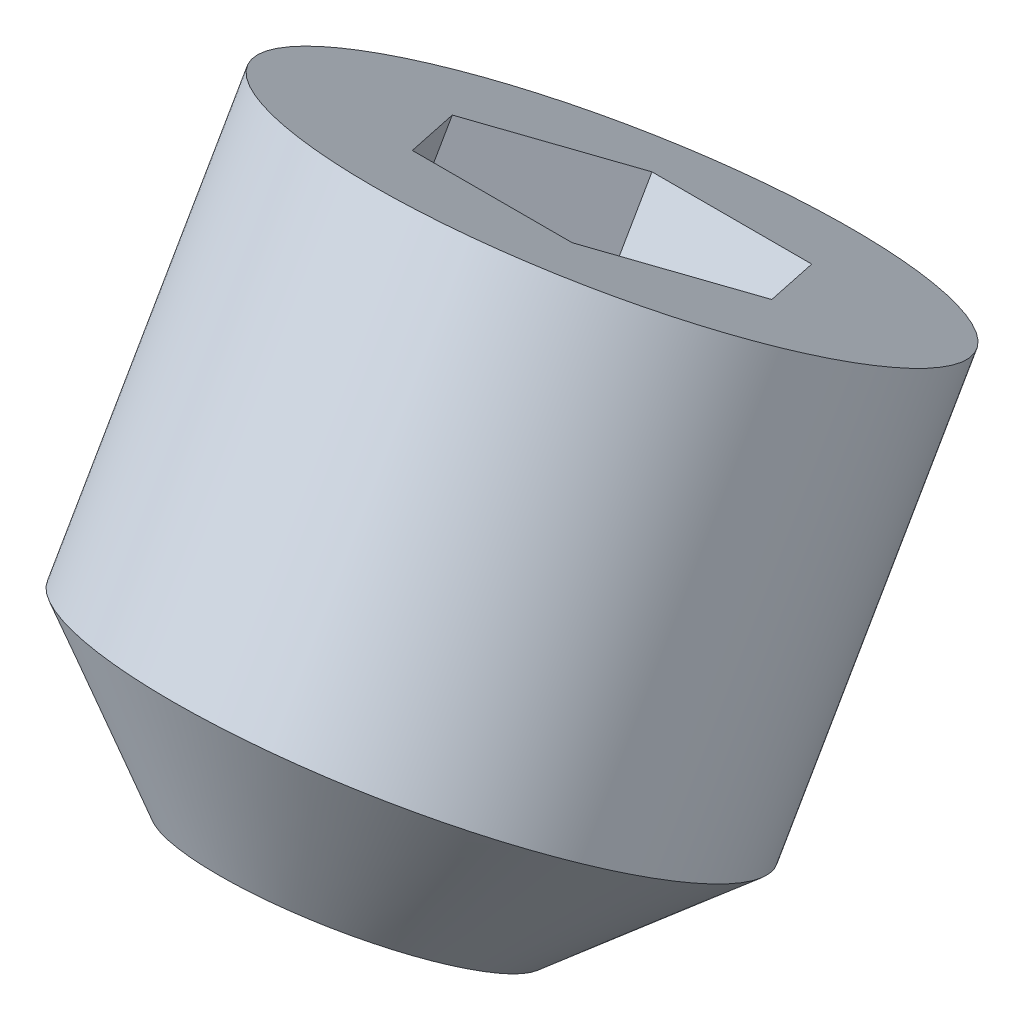
ISO-10303-21;
HEADER;
FILE_DESCRIPTION(('STEP AP214'),'2;1');
FILE_NAME('part.step','',(''),(''),'','','');
FILE_SCHEMA(('AUTOMOTIVE_DESIGN { 1 0 10303 214 1 1 1 1 }'));
ENDSEC;
DATA;
#1=APPLICATION_CONTEXT('core data for automotive mechanical design processes');
#2=APPLICATION_PROTOCOL_DEFINITION('international standard','automotive_design',2000,#1);
#3=PRODUCT_CONTEXT('',#1,'mechanical');
#4=PRODUCT('Part','Part','',(#3));
#5=PRODUCT_RELATED_PRODUCT_CATEGORY('part','',(#4));
#6=PRODUCT_DEFINITION_FORMATION('','',#4);
#7=PRODUCT_DEFINITION_CONTEXT('part definition',#1,'design');
#8=PRODUCT_DEFINITION('design','',#6,#7);
#9=PRODUCT_DEFINITION_SHAPE('','',#8);
#10=(LENGTH_UNIT() NAMED_UNIT(*) SI_UNIT(.MILLI.,.METRE.));
#11=(NAMED_UNIT(*) PLANE_ANGLE_UNIT() SI_UNIT($,.RADIAN.));
#12=(NAMED_UNIT(*) SI_UNIT($,.STERADIAN.) SOLID_ANGLE_UNIT());
#13=UNCERTAINTY_MEASURE_WITH_UNIT(LENGTH_MEASURE(1.E-05),#10,'distance_accuracy_value','');
#14=(GEOMETRIC_REPRESENTATION_CONTEXT(3) GLOBAL_UNCERTAINTY_ASSIGNED_CONTEXT((#13)) GLOBAL_UNIT_ASSIGNED_CONTEXT((#10,
#11,#12)) REPRESENTATION_CONTEXT('',''));
#15=CARTESIAN_POINT('',(0.,0.,0.));
#16=DIRECTION('',(0.,0.,1.));
#17=DIRECTION('',(1.,0.,0.));
#18=AXIS2_PLACEMENT_3D('',#15,#16,#17);
#19=CARTESIAN_POINT('',(22.6,26.7731753579959,-15.4575));
#20=DIRECTION('',(0.,0.866025403784438,-0.5));
#21=DIRECTION('',(0.,0.5,0.866025403784438));
#22=AXIS2_PLACEMENT_3D('',#19,#20,#21);
#23=PLANE('',#22);
#24=DIRECTION('',(0.500000000000001,-0.433012701892219,-0.749999999999999));
#25=VECTOR('',#24,1.);
#26=CARTESIAN_POINT('',(24.0433756729741,28.0231753579959,-13.2924364905389));
#27=LINE('',#26,#25);
#28=CARTESIAN_POINT('',(24.0433756729741,28.0231753579959,-13.2924364905389));
#29=VERTEX_POINT('',#28);
#30=CARTESIAN_POINT('',(25.4867513459481,26.7731753579959,-15.4575));
#31=VERTEX_POINT('',#30);
#32=EDGE_CURVE('E127',#29,#31,#27,.T.);
#33=ORIENTED_EDGE('',*,*,#32,.T.);
#34=DIRECTION('',(-0.5,-0.43301270189222,-0.75));
#35=VECTOR('',#34,1.);
#36=CARTESIAN_POINT('',(25.4867513459481,26.7731753579959,-15.4575));
#37=LINE('',#36,#35);
#38=CARTESIAN_POINT('',(24.0433756729741,25.5231753579959,-17.6225635094611));
#39=VERTEX_POINT('',#38);
#40=EDGE_CURVE('E67',#31,#39,#37,.T.);
#41=ORIENTED_EDGE('',*,*,#40,.T.);
#42=DIRECTION('',(1.,0.,0.));
#43=VECTOR('',#42,1.);
#44=CARTESIAN_POINT('',(23.321687836487,25.5231753579959,-17.6225635094611));
#45=LINE('',#44,#43);
#46=CARTESIAN_POINT('',(21.1566243270259,25.5231753579959,-17.6225635094611));
#47=VERTEX_POINT('',#46);
#48=EDGE_CURVE('E131',#39,#47,#45,.F.);
#49=ORIENTED_EDGE('',*,*,#48,.T.);
#50=DIRECTION('',(-0.5,0.43301270189222,0.75));
#51=VECTOR('',#50,1.);
#52=CARTESIAN_POINT('',(21.1566243270259,25.5231753579959,-17.6225635094611));
#53=LINE('',#52,#51);
#54=CARTESIAN_POINT('',(19.7132486540519,26.7731753579959,-15.4575));
#55=VERTEX_POINT('',#54);
#56=EDGE_CURVE('E139',#47,#55,#53,.T.);
#57=ORIENTED_EDGE('',*,*,#56,.T.);
#58=DIRECTION('',(0.500000000000001,0.433012701892219,0.749999999999999));
#59=VECTOR('',#58,1.);
#60=CARTESIAN_POINT('',(19.7132486540519,26.7731753579959,-15.4575));
#61=LINE('',#60,#59);
#62=CARTESIAN_POINT('',(21.1566243270259,28.0231753579959,-13.2924364905389));
#63=VERTEX_POINT('',#62);
#64=EDGE_CURVE('E149',#55,#63,#61,.T.);
#65=ORIENTED_EDGE('',*,*,#64,.T.);
#66=DIRECTION('',(1.,0.,0.));
#67=VECTOR('',#66,1.);
#68=CARTESIAN_POINT('',(22.6,28.0231753579959,-13.2924364905389));
#69=LINE('',#68,#67);
#70=EDGE_CURVE('E153',#63,#29,#69,.T.);
#71=ORIENTED_EDGE('',*,*,#70,.T.);
#72=EDGE_LOOP('',(#33,#41,#49,#57,#65,#71));
#73=FACE_BOUND('',#72,.T.);
#74=ADVANCED_FACE('F16',(#73),#23,.T.);
#75=CARTESIAN_POINT('',(22.5999999998976,23.0006350946326,-13.2794228634339));
#76=DIRECTION('',(0.,-0.866025403784438,0.500000000000001));
#77=DIRECTION('',(0.,-0.500000000000001,-0.866025403784438));
#78=AXIS2_PLACEMENT_3D('',#75,#76,#77);
#79=CONICAL_SURFACE('',#78,0.,1.04719755120439);
#80=CARTESIAN_POINT('',(22.6,21.6506350946542,-12.500000000025));
#81=DIRECTION('',(0.,0.866025403784438,-0.500000000000001));
#82=DIRECTION('',(1.,1.69745904574229E-12,2.94003504667551E-12));
#83=AXIS2_PLACEMENT_3D('',#80,#81,#82);
#84=CIRCLE('',#83,2.70000000001564);
#85=CARTESIAN_POINT('',(25.3000000000156,21.6506350946588,-12.5000000000171));
#86=VERTEX_POINT('',#85);
#87=EDGE_CURVE('E135',#86,#86,#84,.T.);
#88=ORIENTED_EDGE('',*,*,#87,.F.);
#89=EDGE_LOOP('',(#88));
#90=FACE_BOUND('',#89,.T.);
#91=CARTESIAN_POINT('',(22.5999999999432,23.0006350946198,-13.2794228634171));
#92=VERTEX_POINT('',#91);
#93=VERTEX_LOOP('',#92);
#94=FACE_BOUND('',#93,.T.);
#95=ADVANCED_FACE('F71',(#90,#94),#79,.F.);
#96=CARTESIAN_POINT('',(23.321687836487,25.5231753579959,-17.6225635094611));
#97=DIRECTION('',(0.,-0.5,-0.866025403784438));
#98=DIRECTION('',(0.,0.866025403784438,-0.5));
#99=AXIS2_PLACEMENT_3D('',#96,#97,#98);
#100=PLANE('',#99);
#101=DIRECTION('',(0.,-0.866025403784439,0.5));
#102=VECTOR('',#101,1.);
#103=CARTESIAN_POINT('',(21.1566243270259,28.6538571926767,-19.4300635094611));
#104=LINE('',#103,#102);
#105=CARTESIAN_POINT('',(21.1566243270259,28.6538571926767,-19.4300635094611));
#106=VERTEX_POINT('',#105);
#107=EDGE_CURVE('E141',#106,#47,#104,.T.);
#108=ORIENTED_EDGE('',*,*,#107,.T.);
#109=ORIENTED_EDGE('',*,*,#48,.F.);
#110=DIRECTION('',(0.,0.866025403784438,-0.500000000000001));
#111=VECTOR('',#110,1.);
#112=CARTESIAN_POINT('',(24.0433756729741,25.5231753579959,-17.6225635094611));
#113=LINE('',#112,#111);
#114=CARTESIAN_POINT('',(24.0433756729741,28.6538571926767,-19.4300635094611));
#115=VERTEX_POINT('',#114);
#116=EDGE_CURVE('E122',#39,#115,#113,.T.);
#117=ORIENTED_EDGE('',*,*,#116,.T.);
#118=DIRECTION('',(1.,0.,0.));
#119=VECTOR('',#118,1.);
#120=CARTESIAN_POINT('',(25.1,28.6538571926767,-19.4300635094611));
#121=LINE('',#120,#119);
#122=EDGE_CURVE('E137',#106,#115,#121,.T.);
#123=ORIENTED_EDGE('',*,*,#122,.F.);
#124=EDGE_LOOP('',(#108,#109,#117,#123));
#125=FACE_BOUND('',#124,.T.);
#126=ADVANCED_FACE('F73',(#125),#100,.F.);
#127=CARTESIAN_POINT('',(24.7650635094611,26.1481753579959,-16.5400317547306));
#128=DIRECTION('',(0.866025403784439,-0.25,-0.433012701892219));
#129=DIRECTION('',(-0.447213595499958,0.,-0.894427190999916));
#130=AXIS2_PLACEMENT_3D('',#127,#128,#129);
#131=PLANE('',#130);
#132=ORIENTED_EDGE('',*,*,#116,.F.);
#133=ORIENTED_EDGE('',*,*,#40,.F.);
#134=DIRECTION('',(0.,0.866025403784438,-0.5));
#135=VECTOR('',#134,1.);
#136=CARTESIAN_POINT('',(25.4867513459481,26.7731753579959,-15.4575));
#137=LINE('',#136,#135);
#138=CARTESIAN_POINT('',(25.4867513459481,29.9038571926767,-17.265));
#139=VERTEX_POINT('',#138);
#140=EDGE_CURVE('E129',#31,#139,#137,.T.);
#141=ORIENTED_EDGE('',*,*,#140,.T.);
#142=DIRECTION('',(0.500000000000001,0.43301270189222,0.749999999999999));
#143=VECTOR('',#142,1.);
#144=CARTESIAN_POINT('',(24.0433756729741,28.6538571926767,-19.4300635094611));
#145=LINE('',#144,#143);
#146=EDGE_CURVE('E125',#115,#139,#145,.T.);
#147=ORIENTED_EDGE('',*,*,#146,.F.);
#148=EDGE_LOOP('',(#132,#133,#141,#147));
#149=FACE_BOUND('',#148,.T.);
#150=ADVANCED_FACE('F80',(#149),#131,.F.);
#151=CARTESIAN_POINT('',(24.7650635094611,27.3981753579959,-14.3749682452695));
#152=DIRECTION('',(0.866025403784438,0.25,0.43301270189222));
#153=DIRECTION('',(0.447213595499958,0.,-0.894427190999916));
#154=AXIS2_PLACEMENT_3D('',#151,#152,#153);
#155=PLANE('',#154);
#156=ORIENTED_EDGE('',*,*,#140,.F.);
#157=ORIENTED_EDGE('',*,*,#32,.F.);
#158=DIRECTION('',(0.,-0.866025403784438,0.5));
#159=VECTOR('',#158,1.);
#160=CARTESIAN_POINT('',(24.0433756729741,28.0231753579959,-13.2924364905389));
#161=LINE('',#160,#159);
#162=CARTESIAN_POINT('',(24.0433756729741,31.1538571926767,-15.0999364905389));
#163=VERTEX_POINT('',#162);
#164=EDGE_CURVE('E151',#29,#163,#161,.F.);
#165=ORIENTED_EDGE('',*,*,#164,.T.);
#166=DIRECTION('',(-0.500000000000001,0.43301270189222,0.749999999999999));
#167=VECTOR('',#166,1.);
#168=CARTESIAN_POINT('',(25.4867513459481,29.9038571926767,-17.265));
#169=LINE('',#168,#167);
#170=EDGE_CURVE('E157',#139,#163,#169,.T.);
#171=ORIENTED_EDGE('',*,*,#170,.F.);
#172=EDGE_LOOP('',(#156,#157,#165,#171));
#173=FACE_BOUND('',#172,.T.);
#174=ADVANCED_FACE('F111',(#173),#155,.F.);
#175=CARTESIAN_POINT('',(22.6,28.0231753579959,-13.2924364905389));
#176=DIRECTION('',(0.,0.5,0.866025403784438));
#177=DIRECTION('',(0.,-0.866025403784438,0.5));
#178=AXIS2_PLACEMENT_3D('',#175,#176,#177);
#179=PLANE('',#178);
#180=ORIENTED_EDGE('',*,*,#164,.F.);
#181=ORIENTED_EDGE('',*,*,#70,.F.);
#182=DIRECTION('',(0.,0.866025403784438,-0.5));
#183=VECTOR('',#182,1.);
#184=CARTESIAN_POINT('',(21.1566243270259,28.0231753579959,-13.2924364905389));
#185=LINE('',#184,#183);
#186=CARTESIAN_POINT('',(21.1566243270259,31.1538571926767,-15.0999364905389));
#187=VERTEX_POINT('',#186);
#188=EDGE_CURVE('E147',#63,#187,#185,.T.);
#189=ORIENTED_EDGE('',*,*,#188,.T.);
#190=DIRECTION('',(1.,0.,0.));
#191=VECTOR('',#190,1.);
#192=CARTESIAN_POINT('',(25.1,31.1538571926767,-15.0999364905389));
#193=LINE('',#192,#191);
#194=EDGE_CURVE('E162',#163,#187,#193,.F.);
#195=ORIENTED_EDGE('',*,*,#194,.F.);
#196=EDGE_LOOP('',(#180,#181,#189,#195));
#197=FACE_BOUND('',#196,.T.);
#198=ADVANCED_FACE('F108',(#197),#179,.F.);
#199=CARTESIAN_POINT('',(20.4349364905389,27.3981753579959,-14.3749682452695));
#200=DIRECTION('',(-0.866025403784439,0.25,0.433012701892219));
#201=DIRECTION('',(0.447213595499958,0.,0.894427190999916));
#202=AXIS2_PLACEMENT_3D('',#199,#200,#201);
#203=PLANE('',#202);
#204=ORIENTED_EDGE('',*,*,#188,.F.);
#205=ORIENTED_EDGE('',*,*,#64,.F.);
#206=DIRECTION('',(0.,0.866025403784439,-0.5));
#207=VECTOR('',#206,1.);
#208=CARTESIAN_POINT('',(19.7132486540519,26.7731753579959,-15.4575));
#209=LINE('',#208,#207);
#210=CARTESIAN_POINT('',(19.7132486540519,29.9038571926767,-17.265));
#211=VERTEX_POINT('',#210);
#212=EDGE_CURVE('E32',#55,#211,#209,.T.);
#213=ORIENTED_EDGE('',*,*,#212,.T.);
#214=DIRECTION('',(-0.500000000000001,-0.43301270189222,-0.749999999999999));
#215=VECTOR('',#214,1.);
#216=CARTESIAN_POINT('',(21.1566243270259,31.1538571926767,-15.0999364905389));
#217=LINE('',#216,#215);
#218=EDGE_CURVE('E169',#187,#211,#217,.T.);
#219=ORIENTED_EDGE('',*,*,#218,.F.);
#220=EDGE_LOOP('',(#204,#205,#213,#219));
#221=FACE_BOUND('',#220,.T.);
#222=ADVANCED_FACE('F104',(#221),#203,.F.);
#223=CARTESIAN_POINT('',(20.4349364905389,26.1481753579959,-16.5400317547306));
#224=DIRECTION('',(-0.866025403784439,-0.25,-0.433012701892219));
#225=DIRECTION('',(-0.447213595499958,0.,0.894427190999916));
#226=AXIS2_PLACEMENT_3D('',#223,#224,#225);
#227=PLANE('',#226);
#228=ORIENTED_EDGE('',*,*,#212,.F.);
#229=ORIENTED_EDGE('',*,*,#56,.F.);
#230=ORIENTED_EDGE('',*,*,#107,.F.);
#231=DIRECTION('',(0.500000000000002,-0.43301270189222,-0.749999999999999));
#232=VECTOR('',#231,1.);
#233=CARTESIAN_POINT('',(19.7132486540519,29.9038571926767,-17.265));
#234=LINE('',#233,#232);
#235=EDGE_CURVE('E171',#211,#106,#234,.T.);
#236=ORIENTED_EDGE('',*,*,#235,.F.);
#237=EDGE_LOOP('',(#228,#229,#230,#236));
#238=FACE_BOUND('',#237,.T.);
#239=ADVANCED_FACE('F100',(#238),#227,.F.);
#240=CARTESIAN_POINT('',(22.6,23.6424935232631,-13.6499999999699));
#241=DIRECTION('',(0.,0.866025403784438,-0.500000000000001));
#242=DIRECTION('',(0.,0.500000000000001,0.866025403784438));
#243=AXIS2_PLACEMENT_3D('',#240,#241,#242);
#244=CONICAL_SURFACE('',#243,4.99999999994988,0.785398163390429);
#245=ORIENTED_EDGE('',*,*,#87,.T.);
#246=EDGE_LOOP('',(#245));
#247=FACE_BOUND('',#246,.T.);
#248=CARTESIAN_POINT('',(22.6,23.6424935233152,-13.65));
#249=DIRECTION('',(0.,0.866025403784438,-0.500000000000001));
#250=DIRECTION('',(0.,0.500000000000001,0.866025403784438));
#251=AXIS2_PLACEMENT_3D('',#248,#249,#250);
#252=CIRCLE('',#251,5.);
#253=CARTESIAN_POINT('',(22.6,26.1424935233152,-9.31987298107782));
#254=VERTEX_POINT('',#253);
#255=EDGE_CURVE('E24',#254,#254,#252,.T.);
#256=ORIENTED_EDGE('',*,*,#255,.F.);
#257=EDGE_LOOP('',(#256));
#258=FACE_BOUND('',#257,.T.);
#259=ADVANCED_FACE('F92',(#247,#258),#244,.T.);
#260=CARTESIAN_POINT('',(25.1,29.9038571926767,-17.265));
#261=DIRECTION('',(0.,0.866025403784438,-0.500000000000001));
#262=DIRECTION('',(0.,0.500000000000001,0.866025403784438));
#263=AXIS2_PLACEMENT_3D('',#260,#261,#262);
#264=PLANE('',#263);
#265=CARTESIAN_POINT('',(22.6,29.9038571926767,-17.265));
#266=DIRECTION('',(0.,0.866025403784438,-0.500000000000001));
#267=DIRECTION('',(0.,0.500000000000001,0.866025403784438));
#268=AXIS2_PLACEMENT_3D('',#265,#266,#267);
#269=CIRCLE('',#268,5.);
#270=CARTESIAN_POINT('',(22.6,32.4038571926767,-12.9348729810778));
#271=VERTEX_POINT('',#270);
#272=EDGE_CURVE('E11',#271,#271,#269,.F.);
#273=ORIENTED_EDGE('',*,*,#272,.F.);
#274=EDGE_LOOP('',(#273));
#275=FACE_BOUND('',#274,.T.);
#276=ORIENTED_EDGE('',*,*,#218,.T.);
#277=ORIENTED_EDGE('',*,*,#235,.T.);
#278=ORIENTED_EDGE('',*,*,#122,.T.);
#279=ORIENTED_EDGE('',*,*,#146,.T.);
#280=ORIENTED_EDGE('',*,*,#170,.T.);
#281=ORIENTED_EDGE('',*,*,#194,.T.);
#282=EDGE_LOOP('',(#276,#277,#278,#279,#280,#281));
#283=FACE_BOUND('',#282,.T.);
#284=ADVANCED_FACE('F86',(#275,#283),#264,.T.);
#285=CARTESIAN_POINT('',(22.6,26.7731753579959,-15.4575));
#286=DIRECTION('',(0.,0.866025403784438,-0.500000000000001));
#287=DIRECTION('',(0.,0.500000000000001,0.866025403784438));
#288=AXIS2_PLACEMENT_3D('',#285,#286,#287);
#289=CYLINDRICAL_SURFACE('',#288,5.);
#290=ORIENTED_EDGE('',*,*,#255,.T.);
#291=EDGE_LOOP('',(#290));
#292=FACE_BOUND('',#291,.T.);
#293=ORIENTED_EDGE('',*,*,#272,.T.);
#294=EDGE_LOOP('',(#293));
#295=FACE_BOUND('',#294,.T.);
#296=ADVANCED_FACE('F84',(#292,#295),#289,.T.);
#297=CLOSED_SHELL('',(#74,#95,#126,#150,#174,#198,#222,#239,#259,#284,#296));
#298=MANIFOLD_SOLID_BREP('B1',#297);
#299=ADVANCED_BREP_SHAPE_REPRESENTATION('',(#18,#298),#14);
#300=SHAPE_DEFINITION_REPRESENTATION(#9,#299);
ENDSEC;
END-ISO-10303-21;
